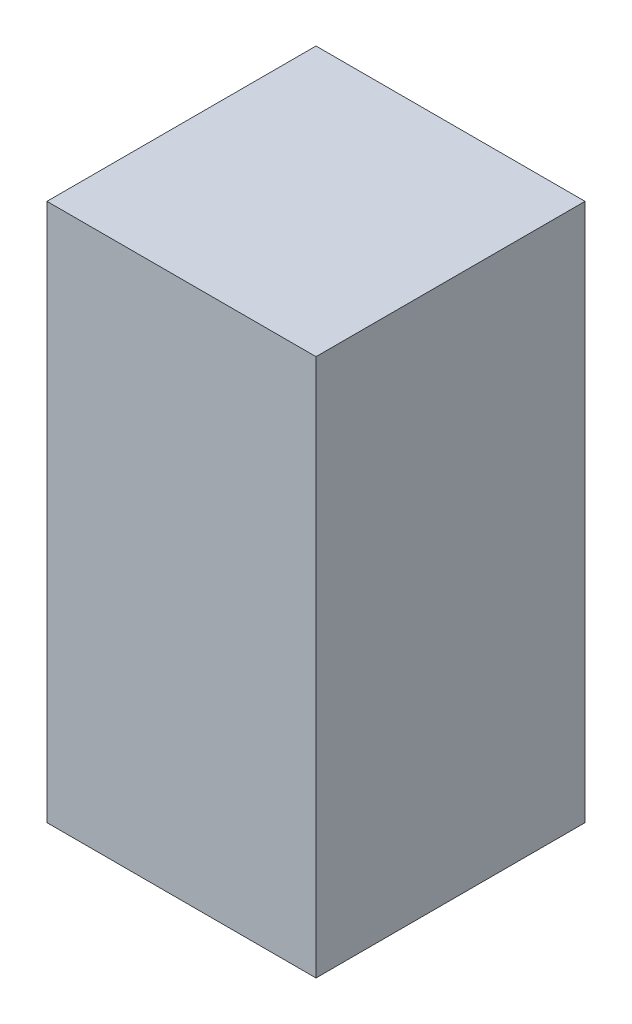
ISO-10303-21;
HEADER;
FILE_DESCRIPTION(('STEP AP214'),'2;1');
FILE_NAME('part.step','',(''),(''),'','','');
FILE_SCHEMA(('AUTOMOTIVE_DESIGN { 1 0 10303 214 1 1 1 1 }'));
ENDSEC;
DATA;
#1=APPLICATION_CONTEXT('core data for automotive mechanical design processes');
#2=APPLICATION_PROTOCOL_DEFINITION('international standard','automotive_design',2000,#1);
#3=PRODUCT_CONTEXT('',#1,'mechanical');
#4=PRODUCT('Part','Part','',(#3));
#5=PRODUCT_RELATED_PRODUCT_CATEGORY('part','',(#4));
#6=PRODUCT_DEFINITION_FORMATION('','',#4);
#7=PRODUCT_DEFINITION_CONTEXT('part definition',#1,'design');
#8=PRODUCT_DEFINITION('design','',#6,#7);
#9=PRODUCT_DEFINITION_SHAPE('','',#8);
#10=(LENGTH_UNIT() NAMED_UNIT(*) SI_UNIT(.MILLI.,.METRE.));
#11=(NAMED_UNIT(*) PLANE_ANGLE_UNIT() SI_UNIT($,.RADIAN.));
#12=(NAMED_UNIT(*) SI_UNIT($,.STERADIAN.) SOLID_ANGLE_UNIT());
#13=UNCERTAINTY_MEASURE_WITH_UNIT(LENGTH_MEASURE(1.E-05),#10,'distance_accuracy_value','');
#14=(GEOMETRIC_REPRESENTATION_CONTEXT(3) GLOBAL_UNCERTAINTY_ASSIGNED_CONTEXT((#13)) GLOBAL_UNIT_ASSIGNED_CONTEXT((#10,
#11,#12)) REPRESENTATION_CONTEXT('',''));
#15=CARTESIAN_POINT('',(0.,0.,0.));
#16=DIRECTION('',(0.,0.,1.));
#17=DIRECTION('',(1.,0.,0.));
#18=AXIS2_PLACEMENT_3D('',#15,#16,#17);
#19=CARTESIAN_POINT('',(10.,40.,-10.));
#20=DIRECTION('',(-1.,0.,0.));
#21=DIRECTION('',(0.,0.,1.));
#22=AXIS2_PLACEMENT_3D('',#19,#20,#21);
#23=PLANE('',#22);
#24=DIRECTION('',(0.,0.,-1.));
#25=VECTOR('',#24,1.);
#26=CARTESIAN_POINT('',(10.,0.,-10.));
#27=LINE('',#26,#25);
#28=CARTESIAN_POINT('',(10.,0.,10.));
#29=VERTEX_POINT('',#28);
#30=CARTESIAN_POINT('',(10.,0.,-10.));
#31=VERTEX_POINT('',#30);
#32=EDGE_CURVE('E104',#29,#31,#27,.T.);
#33=ORIENTED_EDGE('',*,*,#32,.T.);
#34=DIRECTION('',(0.,-1.,0.));
#35=VECTOR('',#34,1.);
#36=CARTESIAN_POINT('',(10.,40.,-10.));
#37=LINE('',#36,#35);
#38=CARTESIAN_POINT('',(10.,40.,-10.));
#39=VERTEX_POINT('',#38);
#40=EDGE_CURVE('E11',#39,#31,#37,.T.);
#41=ORIENTED_EDGE('',*,*,#40,.F.);
#42=DIRECTION('',(0.,0.,-1.));
#43=VECTOR('',#42,1.);
#44=CARTESIAN_POINT('',(10.,40.,-10.));
#45=LINE('',#44,#43);
#46=CARTESIAN_POINT('',(10.,40.,10.));
#47=VERTEX_POINT('',#46);
#48=EDGE_CURVE('E92',#47,#39,#45,.T.);
#49=ORIENTED_EDGE('',*,*,#48,.F.);
#50=DIRECTION('',(0.,-1.,0.));
#51=VECTOR('',#50,1.);
#52=CARTESIAN_POINT('',(10.,40.,10.));
#53=LINE('',#52,#51);
#54=EDGE_CURVE('E100',#47,#29,#53,.T.);
#55=ORIENTED_EDGE('',*,*,#54,.T.);
#56=EDGE_LOOP('',(#33,#41,#49,#55));
#57=FACE_BOUND('',#56,.T.);
#58=ADVANCED_FACE('F41',(#57),#23,.F.);
#59=CARTESIAN_POINT('',(-10.,40.,-10.));
#60=DIRECTION('',(0.,0.,1.));
#61=DIRECTION('',(1.,0.,0.));
#62=AXIS2_PLACEMENT_3D('',#59,#60,#61);
#63=PLANE('',#62);
#64=DIRECTION('',(-1.,0.,0.));
#65=VECTOR('',#64,1.);
#66=CARTESIAN_POINT('',(-10.,0.,-10.));
#67=LINE('',#66,#65);
#68=CARTESIAN_POINT('',(-10.,0.,-10.));
#69=VERTEX_POINT('',#68);
#70=EDGE_CURVE('E96',#31,#69,#67,.T.);
#71=ORIENTED_EDGE('',*,*,#70,.T.);
#72=DIRECTION('',(0.,-1.,0.));
#73=VECTOR('',#72,1.);
#74=CARTESIAN_POINT('',(-10.,40.,-10.));
#75=LINE('',#74,#73);
#76=CARTESIAN_POINT('',(-10.,40.,-10.));
#77=VERTEX_POINT('',#76);
#78=EDGE_CURVE('E49',#77,#69,#75,.T.);
#79=ORIENTED_EDGE('',*,*,#78,.F.);
#80=DIRECTION('',(-1.,0.,0.));
#81=VECTOR('',#80,1.);
#82=CARTESIAN_POINT('',(-10.,40.,-10.));
#83=LINE('',#82,#81);
#84=EDGE_CURVE('E87',#39,#77,#83,.T.);
#85=ORIENTED_EDGE('',*,*,#84,.F.);
#86=ORIENTED_EDGE('',*,*,#40,.T.);
#87=EDGE_LOOP('',(#71,#79,#85,#86));
#88=FACE_BOUND('',#87,.T.);
#89=ADVANCED_FACE('F95',(#88),#63,.F.);
#90=CARTESIAN_POINT('',(-10.,40.,-10.));
#91=DIRECTION('',(1.,0.,0.));
#92=DIRECTION('',(0.,0.,-1.));
#93=AXIS2_PLACEMENT_3D('',#90,#91,#92);
#94=PLANE('',#93);
#95=DIRECTION('',(0.,0.,1.));
#96=VECTOR('',#95,1.);
#97=CARTESIAN_POINT('',(-10.,0.,-10.));
#98=LINE('',#97,#96);
#99=CARTESIAN_POINT('',(-10.,0.,10.));
#100=VERTEX_POINT('',#99);
#101=EDGE_CURVE('E74',#69,#100,#98,.T.);
#102=ORIENTED_EDGE('',*,*,#101,.T.);
#103=DIRECTION('',(0.,-1.,0.));
#104=VECTOR('',#103,1.);
#105=CARTESIAN_POINT('',(-10.,40.,10.));
#106=LINE('',#105,#104);
#107=CARTESIAN_POINT('',(-10.,40.,10.));
#108=VERTEX_POINT('',#107);
#109=EDGE_CURVE('E97',#108,#100,#106,.T.);
#110=ORIENTED_EDGE('',*,*,#109,.F.);
#111=DIRECTION('',(0.,0.,1.));
#112=VECTOR('',#111,1.);
#113=CARTESIAN_POINT('',(-10.,40.,-10.));
#114=LINE('',#113,#112);
#115=EDGE_CURVE('E90',#77,#108,#114,.T.);
#116=ORIENTED_EDGE('',*,*,#115,.F.);
#117=ORIENTED_EDGE('',*,*,#78,.T.);
#118=EDGE_LOOP('',(#102,#110,#116,#117));
#119=FACE_BOUND('',#118,.T.);
#120=ADVANCED_FACE('F98',(#119),#94,.F.);
#121=CARTESIAN_POINT('',(-10.,40.,10.));
#122=DIRECTION('',(0.,0.,-1.));
#123=DIRECTION('',(-1.,0.,0.));
#124=AXIS2_PLACEMENT_3D('',#121,#122,#123);
#125=PLANE('',#124);
#126=DIRECTION('',(1.,0.,0.));
#127=VECTOR('',#126,1.);
#128=CARTESIAN_POINT('',(-10.,0.,10.));
#129=LINE('',#128,#127);
#130=EDGE_CURVE('E80',#100,#29,#129,.T.);
#131=ORIENTED_EDGE('',*,*,#130,.T.);
#132=ORIENTED_EDGE('',*,*,#54,.F.);
#133=DIRECTION('',(1.,0.,0.));
#134=VECTOR('',#133,1.);
#135=CARTESIAN_POINT('',(-10.,40.,10.));
#136=LINE('',#135,#134);
#137=EDGE_CURVE('E57',#108,#47,#136,.T.);
#138=ORIENTED_EDGE('',*,*,#137,.F.);
#139=ORIENTED_EDGE('',*,*,#109,.T.);
#140=EDGE_LOOP('',(#131,#132,#138,#139));
#141=FACE_BOUND('',#140,.T.);
#142=ADVANCED_FACE('F111',(#141),#125,.F.);
#143=CARTESIAN_POINT('',(0.,40.,0.));
#144=DIRECTION('',(0.,1.,0.));
#145=DIRECTION('',(0.,0.,1.));
#146=AXIS2_PLACEMENT_3D('',#143,#144,#145);
#147=PLANE('',#146);
#148=ORIENTED_EDGE('',*,*,#48,.T.);
#149=ORIENTED_EDGE('',*,*,#84,.T.);
#150=ORIENTED_EDGE('',*,*,#115,.T.);
#151=ORIENTED_EDGE('',*,*,#137,.T.);
#152=EDGE_LOOP('',(#148,#149,#150,#151));
#153=FACE_BOUND('',#152,.T.);
#154=ADVANCED_FACE('F88',(#153),#147,.T.);
#155=CARTESIAN_POINT('',(0.,0.,0.));
#156=DIRECTION('',(0.,1.,0.));
#157=DIRECTION('',(0.,0.,1.));
#158=AXIS2_PLACEMENT_3D('',#155,#156,#157);
#159=PLANE('',#158);
#160=ORIENTED_EDGE('',*,*,#32,.F.);
#161=ORIENTED_EDGE('',*,*,#130,.F.);
#162=ORIENTED_EDGE('',*,*,#101,.F.);
#163=ORIENTED_EDGE('',*,*,#70,.F.);
#164=EDGE_LOOP('',(#160,#161,#162,#163));
#165=FACE_BOUND('',#164,.T.);
#166=ADVANCED_FACE('F114',(#165),#159,.F.);
#167=CLOSED_SHELL('',(#58,#89,#120,#142,#154,#166));
#168=MANIFOLD_SOLID_BREP('B2',#167);
#169=ADVANCED_BREP_SHAPE_REPRESENTATION('',(#18,#168),#14);
#170=SHAPE_DEFINITION_REPRESENTATION(#9,#169);
ENDSEC;
END-ISO-10303-21;
